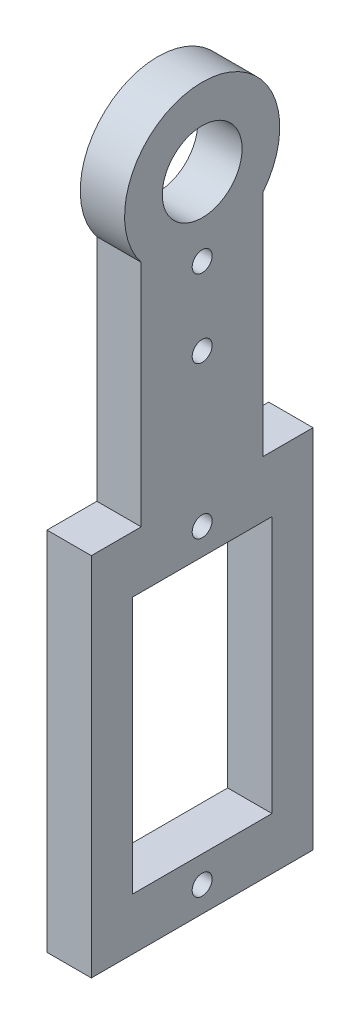
ISO-10303-21;
HEADER;
FILE_DESCRIPTION(('STEP AP214'),'2;1');
FILE_NAME('part.step','',(''),(''),'','','');
FILE_SCHEMA(('AUTOMOTIVE_DESIGN { 1 0 10303 214 1 1 1 1 }'));
ENDSEC;
DATA;
#1=APPLICATION_CONTEXT('core data for automotive mechanical design processes');
#2=APPLICATION_PROTOCOL_DEFINITION('international standard','automotive_design',2000,#1);
#3=PRODUCT_CONTEXT('',#1,'mechanical');
#4=PRODUCT('Part','Part','',(#3));
#5=PRODUCT_RELATED_PRODUCT_CATEGORY('part','',(#4));
#6=PRODUCT_DEFINITION_FORMATION('','',#4);
#7=PRODUCT_DEFINITION_CONTEXT('part definition',#1,'design');
#8=PRODUCT_DEFINITION('design','',#6,#7);
#9=PRODUCT_DEFINITION_SHAPE('','',#8);
#10=(LENGTH_UNIT() NAMED_UNIT(*) SI_UNIT(.MILLI.,.METRE.));
#11=(NAMED_UNIT(*) PLANE_ANGLE_UNIT() SI_UNIT($,.RADIAN.));
#12=(NAMED_UNIT(*) SI_UNIT($,.STERADIAN.) SOLID_ANGLE_UNIT());
#13=UNCERTAINTY_MEASURE_WITH_UNIT(LENGTH_MEASURE(1.E-05),#10,'distance_accuracy_value','');
#14=(GEOMETRIC_REPRESENTATION_CONTEXT(3) GLOBAL_UNCERTAINTY_ASSIGNED_CONTEXT((#13)) GLOBAL_UNIT_ASSIGNED_CONTEXT((#10,
#11,#12)) REPRESENTATION_CONTEXT('',''));
#15=CARTESIAN_POINT('',(0.,0.,0.));
#16=DIRECTION('',(0.,0.,1.));
#17=DIRECTION('',(1.,0.,0.));
#18=AXIS2_PLACEMENT_3D('',#15,#16,#17);
#19=CARTESIAN_POINT('',(4.,0.,0.));
#20=DIRECTION('',(1.,0.,0.));
#21=DIRECTION('',(0.,0.,-1.));
#22=AXIS2_PLACEMENT_3D('',#19,#20,#21);
#23=PLANE('',#22);
#24=CARTESIAN_POINT('',(4.,-55.7,0.));
#25=DIRECTION('',(1.,0.,0.));
#26=DIRECTION('',(0.,0.,-1.));
#27=AXIS2_PLACEMENT_3D('',#24,#25,#26);
#28=CIRCLE('',#27,0.9);
#29=CARTESIAN_POINT('',(4.,-55.7,-0.9));
#30=VERTEX_POINT('',#29);
#31=EDGE_CURVE('E237',#30,#30,#28,.F.);
#32=ORIENTED_EDGE('',*,*,#31,.T.);
#33=EDGE_LOOP('',(#32));
#34=FACE_BOUND('',#33,.T.);
#35=CARTESIAN_POINT('',(4.,-27.7,0.));
#36=DIRECTION('',(1.,0.,0.));
#37=DIRECTION('',(0.,0.,-1.));
#38=AXIS2_PLACEMENT_3D('',#35,#36,#37);
#39=CIRCLE('',#38,0.9);
#40=CARTESIAN_POINT('',(4.,-27.7,-0.9));
#41=VERTEX_POINT('',#40);
#42=EDGE_CURVE('E236',#41,#41,#39,.F.);
#43=ORIENTED_EDGE('',*,*,#42,.T.);
#44=EDGE_LOOP('',(#43));
#45=FACE_BOUND('',#44,.T.);
#46=CARTESIAN_POINT('',(4.,-14.,0.));
#47=DIRECTION('',(1.,0.,0.));
#48=DIRECTION('',(0.,0.,-1.));
#49=AXIS2_PLACEMENT_3D('',#46,#47,#48);
#50=CIRCLE('',#49,0.9);
#51=CARTESIAN_POINT('',(4.,-14.,-0.9));
#52=VERTEX_POINT('',#51);
#53=EDGE_CURVE('E155',#52,#52,#50,.F.);
#54=ORIENTED_EDGE('',*,*,#53,.T.);
#55=EDGE_LOOP('',(#54));
#56=FACE_BOUND('',#55,.T.);
#57=CARTESIAN_POINT('',(4.,-7.,0.));
#58=DIRECTION('',(1.,0.,0.));
#59=DIRECTION('',(0.,0.,-1.));
#60=AXIS2_PLACEMENT_3D('',#57,#58,#59);
#61=CIRCLE('',#60,0.9);
#62=CARTESIAN_POINT('',(4.,-7.,-0.9));
#63=VERTEX_POINT('',#62);
#64=EDGE_CURVE('E159',#63,#63,#61,.F.);
#65=ORIENTED_EDGE('',*,*,#64,.T.);
#66=EDGE_LOOP('',(#65));
#67=FACE_BOUND('',#66,.T.);
#68=CARTESIAN_POINT('',(4.,0.,0.));
#69=DIRECTION('',(1.,0.,0.));
#70=DIRECTION('',(0.,0.,-1.));
#71=AXIS2_PLACEMENT_3D('',#68,#69,#70);
#72=CIRCLE('',#71,3.6);
#73=CARTESIAN_POINT('',(4.,0.,-3.6));
#74=VERTEX_POINT('',#73);
#75=EDGE_CURVE('E163',#74,#74,#72,.F.);
#76=ORIENTED_EDGE('',*,*,#75,.T.);
#77=EDGE_LOOP('',(#76));
#78=FACE_BOUND('',#77,.T.);
#79=DIRECTION('',(0.,0.,-1.));
#80=VECTOR('',#79,1.);
#81=CARTESIAN_POINT('',(4.,-25.,10.));
#82=LINE('',#81,#80);
#83=CARTESIAN_POINT('',(4.,-25.,-5.5));
#84=VERTEX_POINT('',#83);
#85=CARTESIAN_POINT('',(4.,-25.,-10.));
#86=VERTEX_POINT('',#85);
#87=EDGE_CURVE('E190',#84,#86,#82,.T.);
#88=ORIENTED_EDGE('',*,*,#87,.F.);
#89=DIRECTION('',(0.,1.,0.));
#90=VECTOR('',#89,1.);
#91=CARTESIAN_POINT('',(4.,-36.,-5.5));
#92=LINE('',#91,#90);
#93=CARTESIAN_POINT('',(4.,-4.33012701892219,-5.5));
#94=VERTEX_POINT('',#93);
#95=EDGE_CURVE('E206',#84,#94,#92,.T.);
#96=ORIENTED_EDGE('',*,*,#95,.T.);
#97=CARTESIAN_POINT('',(4.,0.,0.));
#98=DIRECTION('',(1.,0.,0.));
#99=DIRECTION('',(0.,0.,-1.));
#100=AXIS2_PLACEMENT_3D('',#97,#98,#99);
#101=CIRCLE('',#100,7.);
#102=CARTESIAN_POINT('',(4.,-4.33012701892219,5.5));
#103=VERTEX_POINT('',#102);
#104=EDGE_CURVE('E217',#94,#103,#101,.T.);
#105=ORIENTED_EDGE('',*,*,#104,.T.);
#106=DIRECTION('',(0.,1.,0.));
#107=VECTOR('',#106,1.);
#108=CARTESIAN_POINT('',(4.,-36.,5.5));
#109=LINE('',#108,#107);
#110=CARTESIAN_POINT('',(4.,-25.,5.5));
#111=VERTEX_POINT('',#110);
#112=EDGE_CURVE('E205',#111,#103,#109,.T.);
#113=ORIENTED_EDGE('',*,*,#112,.F.);
#114=CARTESIAN_POINT('',(4.,-25.,10.));
#115=VERTEX_POINT('',#114);
#116=EDGE_CURVE('E191',#115,#111,#82,.T.);
#117=ORIENTED_EDGE('',*,*,#116,.F.);
#118=DIRECTION('',(0.,1.,0.));
#119=VECTOR('',#118,1.);
#120=CARTESIAN_POINT('',(4.,-58.,10.));
#121=LINE('',#120,#119);
#122=CARTESIAN_POINT('',(4.,-58.,10.));
#123=VERTEX_POINT('',#122);
#124=EDGE_CURVE('E173',#123,#115,#121,.T.);
#125=ORIENTED_EDGE('',*,*,#124,.F.);
#126=DIRECTION('',(0.,0.,-1.));
#127=VECTOR('',#126,1.);
#128=CARTESIAN_POINT('',(4.,-58.,10.));
#129=LINE('',#128,#127);
#130=CARTESIAN_POINT('',(4.,-58.,-10.));
#131=VERTEX_POINT('',#130);
#132=EDGE_CURVE('E193',#123,#131,#129,.T.);
#133=ORIENTED_EDGE('',*,*,#132,.T.);
#134=DIRECTION('',(0.,1.,0.));
#135=VECTOR('',#134,1.);
#136=CARTESIAN_POINT('',(4.,-58.,-10.));
#137=LINE('',#136,#135);
#138=EDGE_CURVE('E182',#131,#86,#137,.T.);
#139=ORIENTED_EDGE('',*,*,#138,.T.);
#140=EDGE_LOOP('',(#88,#96,#105,#113,#117,#125,#133,#139));
#141=FACE_BOUND('',#140,.T.);
#142=DIRECTION('',(0.,0.,1.));
#143=VECTOR('',#142,1.);
#144=CARTESIAN_POINT('',(4.,-53.3,0.));
#145=LINE('',#144,#143);
#146=CARTESIAN_POINT('',(4.,-53.3,-6.3));
#147=VERTEX_POINT('',#146);
#148=CARTESIAN_POINT('',(4.,-53.3,6.3));
#149=VERTEX_POINT('',#148);
#150=EDGE_CURVE('E149',#147,#149,#145,.T.);
#151=ORIENTED_EDGE('',*,*,#150,.T.);
#152=DIRECTION('',(0.,1.,0.));
#153=VECTOR('',#152,1.);
#154=CARTESIAN_POINT('',(4.,0.,6.3));
#155=LINE('',#154,#153);
#156=CARTESIAN_POINT('',(4.,-30.1,6.3));
#157=VERTEX_POINT('',#156);
#158=EDGE_CURVE('E135',#149,#157,#155,.T.);
#159=ORIENTED_EDGE('',*,*,#158,.T.);
#160=DIRECTION('',(0.,0.,-1.));
#161=VECTOR('',#160,1.);
#162=CARTESIAN_POINT('',(4.,-30.1,0.));
#163=LINE('',#162,#161);
#164=CARTESIAN_POINT('',(4.,-30.1,-6.3));
#165=VERTEX_POINT('',#164);
#166=EDGE_CURVE('E141',#157,#165,#163,.T.);
#167=ORIENTED_EDGE('',*,*,#166,.T.);
#168=DIRECTION('',(0.,1.,0.));
#169=VECTOR('',#168,1.);
#170=CARTESIAN_POINT('',(4.,0.,-6.3));
#171=LINE('',#170,#169);
#172=EDGE_CURVE('E130',#147,#165,#171,.T.);
#173=ORIENTED_EDGE('',*,*,#172,.F.);
#174=EDGE_LOOP('',(#151,#159,#167,#173));
#175=FACE_BOUND('',#174,.T.);
#176=ADVANCED_FACE('F43',(#34,#45,#56,#67,#78,#141,#175),#23,.T.);
#177=CARTESIAN_POINT('',(0.,0.,0.));
#178=DIRECTION('',(1.,0.,0.));
#179=DIRECTION('',(0.,0.,-1.));
#180=AXIS2_PLACEMENT_3D('',#177,#178,#179);
#181=PLANE('',#180);
#182=CARTESIAN_POINT('',(0.,-55.7,0.));
#183=DIRECTION('',(1.,0.,0.));
#184=DIRECTION('',(0.,0.,-1.));
#185=AXIS2_PLACEMENT_3D('',#182,#183,#184);
#186=CIRCLE('',#185,0.9);
#187=CARTESIAN_POINT('',(0.,-55.7,-0.9));
#188=VERTEX_POINT('',#187);
#189=EDGE_CURVE('E47',#188,#188,#186,.F.);
#190=ORIENTED_EDGE('',*,*,#189,.F.);
#191=EDGE_LOOP('',(#190));
#192=FACE_BOUND('',#191,.T.);
#193=CARTESIAN_POINT('',(0.,-27.7,0.));
#194=DIRECTION('',(1.,0.,0.));
#195=DIRECTION('',(0.,0.,-1.));
#196=AXIS2_PLACEMENT_3D('',#193,#194,#195);
#197=CIRCLE('',#196,0.9);
#198=CARTESIAN_POINT('',(0.,-27.7,-0.9));
#199=VERTEX_POINT('',#198);
#200=EDGE_CURVE('E234',#199,#199,#197,.F.);
#201=ORIENTED_EDGE('',*,*,#200,.F.);
#202=EDGE_LOOP('',(#201));
#203=FACE_BOUND('',#202,.T.);
#204=DIRECTION('',(0.,0.,-1.));
#205=VECTOR('',#204,1.);
#206=CARTESIAN_POINT('',(0.,-25.,10.));
#207=LINE('',#206,#205);
#208=CARTESIAN_POINT('',(0.,-25.,10.));
#209=VERTEX_POINT('',#208);
#210=CARTESIAN_POINT('',(0.,-25.,5.5));
#211=VERTEX_POINT('',#210);
#212=EDGE_CURVE('E187',#209,#211,#207,.T.);
#213=ORIENTED_EDGE('',*,*,#212,.T.);
#214=DIRECTION('',(0.,-1.,0.));
#215=VECTOR('',#214,1.);
#216=CARTESIAN_POINT('',(0.,-36.,5.5));
#217=LINE('',#216,#215);
#218=CARTESIAN_POINT('',(0.,-4.33012701892219,5.5));
#219=VERTEX_POINT('',#218);
#220=EDGE_CURVE('E202',#219,#211,#217,.T.);
#221=ORIENTED_EDGE('',*,*,#220,.F.);
#222=CARTESIAN_POINT('',(0.,0.,0.));
#223=DIRECTION('',(1.,0.,0.));
#224=DIRECTION('',(0.,0.,-1.));
#225=AXIS2_PLACEMENT_3D('',#222,#223,#224);
#226=CIRCLE('',#225,7.);
#227=CARTESIAN_POINT('',(0.,-4.33012701892219,-5.5));
#228=VERTEX_POINT('',#227);
#229=EDGE_CURVE('E216',#228,#219,#226,.T.);
#230=ORIENTED_EDGE('',*,*,#229,.F.);
#231=DIRECTION('',(0.,-1.,0.));
#232=VECTOR('',#231,1.);
#233=CARTESIAN_POINT('',(0.,-36.,-5.5));
#234=LINE('',#233,#232);
#235=CARTESIAN_POINT('',(0.,-25.,-5.5));
#236=VERTEX_POINT('',#235);
#237=EDGE_CURVE('E201',#228,#236,#234,.T.);
#238=ORIENTED_EDGE('',*,*,#237,.T.);
#239=CARTESIAN_POINT('',(0.,-25.,-10.));
#240=VERTEX_POINT('',#239);
#241=EDGE_CURVE('E177',#236,#240,#207,.T.);
#242=ORIENTED_EDGE('',*,*,#241,.T.);
#243=DIRECTION('',(0.,-1.,0.));
#244=VECTOR('',#243,1.);
#245=CARTESIAN_POINT('',(0.,-58.,-10.));
#246=LINE('',#245,#244);
#247=CARTESIAN_POINT('',(0.,-58.,-10.));
#248=VERTEX_POINT('',#247);
#249=EDGE_CURVE('E166',#240,#248,#246,.T.);
#250=ORIENTED_EDGE('',*,*,#249,.T.);
#251=DIRECTION('',(0.,0.,-1.));
#252=VECTOR('',#251,1.);
#253=CARTESIAN_POINT('',(0.,-58.,10.));
#254=LINE('',#253,#252);
#255=CARTESIAN_POINT('',(0.,-58.,10.));
#256=VERTEX_POINT('',#255);
#257=EDGE_CURVE('E196',#256,#248,#254,.T.);
#258=ORIENTED_EDGE('',*,*,#257,.F.);
#259=DIRECTION('',(0.,-1.,0.));
#260=VECTOR('',#259,1.);
#261=CARTESIAN_POINT('',(0.,-58.,10.));
#262=LINE('',#261,#260);
#263=EDGE_CURVE('E167',#209,#256,#262,.T.);
#264=ORIENTED_EDGE('',*,*,#263,.F.);
#265=EDGE_LOOP('',(#213,#221,#230,#238,#242,#250,#258,#264));
#266=FACE_BOUND('',#265,.T.);
#267=CARTESIAN_POINT('',(0.,0.,0.));
#268=DIRECTION('',(1.,0.,0.));
#269=DIRECTION('',(0.,0.,-1.));
#270=AXIS2_PLACEMENT_3D('',#267,#268,#269);
#271=CIRCLE('',#270,3.6);
#272=CARTESIAN_POINT('',(0.,0.,-3.6));
#273=VERTEX_POINT('',#272);
#274=EDGE_CURVE('E162',#273,#273,#271,.F.);
#275=ORIENTED_EDGE('',*,*,#274,.F.);
#276=EDGE_LOOP('',(#275));
#277=FACE_BOUND('',#276,.T.);
#278=CARTESIAN_POINT('',(0.,-7.,0.));
#279=DIRECTION('',(1.,0.,0.));
#280=DIRECTION('',(0.,0.,-1.));
#281=AXIS2_PLACEMENT_3D('',#278,#279,#280);
#282=CIRCLE('',#281,0.9);
#283=CARTESIAN_POINT('',(0.,-7.,-0.9));
#284=VERTEX_POINT('',#283);
#285=EDGE_CURVE('E158',#284,#284,#282,.F.);
#286=ORIENTED_EDGE('',*,*,#285,.F.);
#287=EDGE_LOOP('',(#286));
#288=FACE_BOUND('',#287,.T.);
#289=CARTESIAN_POINT('',(0.,-14.,0.));
#290=DIRECTION('',(1.,0.,0.));
#291=DIRECTION('',(0.,0.,-1.));
#292=AXIS2_PLACEMENT_3D('',#289,#290,#291);
#293=CIRCLE('',#292,0.9);
#294=CARTESIAN_POINT('',(0.,-14.,-0.9));
#295=VERTEX_POINT('',#294);
#296=EDGE_CURVE('E151',#295,#295,#293,.F.);
#297=ORIENTED_EDGE('',*,*,#296,.F.);
#298=EDGE_LOOP('',(#297));
#299=FACE_BOUND('',#298,.T.);
#300=DIRECTION('',(0.,1.,0.));
#301=VECTOR('',#300,1.);
#302=CARTESIAN_POINT('',(0.,0.,6.3));
#303=LINE('',#302,#301);
#304=CARTESIAN_POINT('',(0.,-53.3,6.3));
#305=VERTEX_POINT('',#304);
#306=CARTESIAN_POINT('',(0.,-30.1,6.3));
#307=VERTEX_POINT('',#306);
#308=EDGE_CURVE('E11',#305,#307,#303,.T.);
#309=ORIENTED_EDGE('',*,*,#308,.F.);
#310=DIRECTION('',(0.,0.,1.));
#311=VECTOR('',#310,1.);
#312=CARTESIAN_POINT('',(0.,-53.3,0.));
#313=LINE('',#312,#311);
#314=CARTESIAN_POINT('',(0.,-53.3,-6.3));
#315=VERTEX_POINT('',#314);
#316=EDGE_CURVE('E52',#315,#305,#313,.T.);
#317=ORIENTED_EDGE('',*,*,#316,.F.);
#318=DIRECTION('',(0.,1.,0.));
#319=VECTOR('',#318,1.);
#320=CARTESIAN_POINT('',(0.,0.,-6.3));
#321=LINE('',#320,#319);
#322=CARTESIAN_POINT('',(0.,-30.1,-6.3));
#323=VERTEX_POINT('',#322);
#324=EDGE_CURVE('E225',#315,#323,#321,.T.);
#325=ORIENTED_EDGE('',*,*,#324,.T.);
#326=DIRECTION('',(0.,0.,-1.));
#327=VECTOR('',#326,1.);
#328=CARTESIAN_POINT('',(0.,-30.1,0.));
#329=LINE('',#328,#327);
#330=EDGE_CURVE('E144',#307,#323,#329,.T.);
#331=ORIENTED_EDGE('',*,*,#330,.F.);
#332=EDGE_LOOP('',(#309,#317,#325,#331));
#333=FACE_BOUND('',#332,.T.);
#334=ADVANCED_FACE('F254',(#192,#203,#266,#277,#288,#299,#333),#181,.F.);
#335=CARTESIAN_POINT('',(0.,0.,5.5));
#336=DIRECTION('',(0.,0.,-1.));
#337=DIRECTION('',(-1.,0.,0.));
#338=AXIS2_PLACEMENT_3D('',#335,#336,#337);
#339=PLANE('',#338);
#340=DIRECTION('',(-1.,0.,0.));
#341=VECTOR('',#340,1.);
#342=CARTESIAN_POINT('',(0.,-25.,5.5));
#343=LINE('',#342,#341);
#344=EDGE_CURVE('E199',#111,#211,#343,.T.);
#345=ORIENTED_EDGE('',*,*,#344,.F.);
#346=ORIENTED_EDGE('',*,*,#112,.T.);
#347=DIRECTION('',(-1.,0.,0.));
#348=VECTOR('',#347,1.);
#349=CARTESIAN_POINT('',(4.,-4.33012701892219,5.5));
#350=LINE('',#349,#348);
#351=EDGE_CURVE('E214',#103,#219,#350,.T.);
#352=ORIENTED_EDGE('',*,*,#351,.T.);
#353=ORIENTED_EDGE('',*,*,#220,.T.);
#354=EDGE_LOOP('',(#345,#346,#352,#353));
#355=FACE_BOUND('',#354,.T.);
#356=ADVANCED_FACE('F276',(#355),#339,.F.);
#357=CARTESIAN_POINT('',(0.,0.,-5.5));
#358=DIRECTION('',(0.,0.,-1.));
#359=DIRECTION('',(-1.,0.,0.));
#360=AXIS2_PLACEMENT_3D('',#357,#358,#359);
#361=PLANE('',#360);
#362=ORIENTED_EDGE('',*,*,#95,.F.);
#363=DIRECTION('',(-1.,0.,0.));
#364=VECTOR('',#363,1.);
#365=CARTESIAN_POINT('',(0.,-25.,-5.5));
#366=LINE('',#365,#364);
#367=EDGE_CURVE('E220',#84,#236,#366,.T.);
#368=ORIENTED_EDGE('',*,*,#367,.T.);
#369=ORIENTED_EDGE('',*,*,#237,.F.);
#370=DIRECTION('',(-1.,0.,0.));
#371=VECTOR('',#370,1.);
#372=CARTESIAN_POINT('',(4.,-4.33012701892219,-5.5));
#373=LINE('',#372,#371);
#374=EDGE_CURVE('E208',#94,#228,#373,.T.);
#375=ORIENTED_EDGE('',*,*,#374,.F.);
#376=EDGE_LOOP('',(#362,#368,#369,#375));
#377=FACE_BOUND('',#376,.T.);
#378=ADVANCED_FACE('F280',(#377),#361,.T.);
#379=CARTESIAN_POINT('',(4.,0.,0.));
#380=DIRECTION('',(-1.,0.,0.));
#381=DIRECTION('',(0.,0.,1.));
#382=AXIS2_PLACEMENT_3D('',#379,#380,#381);
#383=CYLINDRICAL_SURFACE('',#382,7.);
#384=ORIENTED_EDGE('',*,*,#351,.F.);
#385=ORIENTED_EDGE('',*,*,#104,.F.);
#386=ORIENTED_EDGE('',*,*,#374,.T.);
#387=ORIENTED_EDGE('',*,*,#229,.T.);
#388=EDGE_LOOP('',(#384,#385,#386,#387));
#389=FACE_BOUND('',#388,.T.);
#390=ADVANCED_FACE('F45',(#389),#383,.T.);
#391=CARTESIAN_POINT('',(0.,-25.,10.));
#392=DIRECTION('',(0.,-1.,0.));
#393=DIRECTION('',(0.,0.,-1.));
#394=AXIS2_PLACEMENT_3D('',#391,#392,#393);
#395=PLANE('',#394);
#396=ORIENTED_EDGE('',*,*,#116,.T.);
#397=ORIENTED_EDGE('',*,*,#344,.T.);
#398=ORIENTED_EDGE('',*,*,#212,.F.);
#399=DIRECTION('',(-1.,0.,0.));
#400=VECTOR('',#399,1.);
#401=CARTESIAN_POINT('',(0.,-25.,10.));
#402=LINE('',#401,#400);
#403=EDGE_CURVE('E175',#115,#209,#402,.T.);
#404=ORIENTED_EDGE('',*,*,#403,.F.);
#405=EDGE_LOOP('',(#396,#397,#398,#404));
#406=FACE_BOUND('',#405,.T.);
#407=ADVANCED_FACE('F291',(#406),#395,.F.);
#408=CARTESIAN_POINT('',(0.,-58.,10.));
#409=DIRECTION('',(0.,1.,0.));
#410=DIRECTION('',(0.,0.,1.));
#411=AXIS2_PLACEMENT_3D('',#408,#409,#410);
#412=PLANE('',#411);
#413=DIRECTION('',(1.,0.,0.));
#414=VECTOR('',#413,1.);
#415=CARTESIAN_POINT('',(0.,-58.,-10.));
#416=LINE('',#415,#414);
#417=EDGE_CURVE('E180',#248,#131,#416,.T.);
#418=ORIENTED_EDGE('',*,*,#417,.T.);
#419=ORIENTED_EDGE('',*,*,#132,.F.);
#420=DIRECTION('',(1.,0.,0.));
#421=VECTOR('',#420,1.);
#422=CARTESIAN_POINT('',(0.,-58.,10.));
#423=LINE('',#422,#421);
#424=EDGE_CURVE('E170',#256,#123,#423,.T.);
#425=ORIENTED_EDGE('',*,*,#424,.F.);
#426=ORIENTED_EDGE('',*,*,#257,.T.);
#427=EDGE_LOOP('',(#418,#419,#425,#426));
#428=FACE_BOUND('',#427,.T.);
#429=ADVANCED_FACE('F287',(#428),#412,.F.);
#430=ORIENTED_EDGE('',*,*,#367,.F.);
#431=ORIENTED_EDGE('',*,*,#87,.T.);
#432=DIRECTION('',(-1.,0.,0.));
#433=VECTOR('',#432,1.);
#434=CARTESIAN_POINT('',(0.,-25.,-10.));
#435=LINE('',#434,#433);
#436=EDGE_CURVE('E171',#86,#240,#435,.T.);
#437=ORIENTED_EDGE('',*,*,#436,.T.);
#438=ORIENTED_EDGE('',*,*,#241,.F.);
#439=EDGE_LOOP('',(#430,#431,#437,#438));
#440=FACE_BOUND('',#439,.T.);
#441=ADVANCED_FACE('F290',(#440),#395,.F.);
#442=CARTESIAN_POINT('',(0.,0.,10.));
#443=DIRECTION('',(0.,0.,-1.));
#444=DIRECTION('',(-1.,0.,0.));
#445=AXIS2_PLACEMENT_3D('',#442,#443,#444);
#446=PLANE('',#445);
#447=ORIENTED_EDGE('',*,*,#263,.T.);
#448=ORIENTED_EDGE('',*,*,#424,.T.);
#449=ORIENTED_EDGE('',*,*,#124,.T.);
#450=ORIENTED_EDGE('',*,*,#403,.T.);
#451=EDGE_LOOP('',(#447,#448,#449,#450));
#452=FACE_BOUND('',#451,.T.);
#453=ADVANCED_FACE('F295',(#452),#446,.F.);
#454=CARTESIAN_POINT('',(0.,0.,-10.));
#455=DIRECTION('',(0.,0.,-1.));
#456=DIRECTION('',(-1.,0.,0.));
#457=AXIS2_PLACEMENT_3D('',#454,#455,#456);
#458=PLANE('',#457);
#459=ORIENTED_EDGE('',*,*,#249,.F.);
#460=ORIENTED_EDGE('',*,*,#436,.F.);
#461=ORIENTED_EDGE('',*,*,#138,.F.);
#462=ORIENTED_EDGE('',*,*,#417,.F.);
#463=EDGE_LOOP('',(#459,#460,#461,#462));
#464=FACE_BOUND('',#463,.T.);
#465=ADVANCED_FACE('F297',(#464),#458,.T.);
#466=CARTESIAN_POINT('',(5.,0.,0.));
#467=DIRECTION('',(-1.,0.,0.));
#468=DIRECTION('',(0.,0.,1.));
#469=AXIS2_PLACEMENT_3D('',#466,#467,#468);
#470=CYLINDRICAL_SURFACE('',#469,3.6);
#471=ORIENTED_EDGE('',*,*,#75,.F.);
#472=EDGE_LOOP('',(#471));
#473=FACE_BOUND('',#472,.T.);
#474=ORIENTED_EDGE('',*,*,#274,.T.);
#475=EDGE_LOOP('',(#474));
#476=FACE_BOUND('',#475,.T.);
#477=ADVANCED_FACE('F300',(#473,#476),#470,.F.);
#478=CARTESIAN_POINT('',(5.,-7.,0.));
#479=DIRECTION('',(-1.,0.,0.));
#480=DIRECTION('',(0.,0.,1.));
#481=AXIS2_PLACEMENT_3D('',#478,#479,#480);
#482=CYLINDRICAL_SURFACE('',#481,0.9);
#483=ORIENTED_EDGE('',*,*,#64,.F.);
#484=EDGE_LOOP('',(#483));
#485=FACE_BOUND('',#484,.T.);
#486=ORIENTED_EDGE('',*,*,#285,.T.);
#487=EDGE_LOOP('',(#486));
#488=FACE_BOUND('',#487,.T.);
#489=ADVANCED_FACE('F307',(#485,#488),#482,.F.);
#490=CARTESIAN_POINT('',(5.,-14.,0.));
#491=DIRECTION('',(-1.,0.,0.));
#492=DIRECTION('',(0.,0.,1.));
#493=AXIS2_PLACEMENT_3D('',#490,#491,#492);
#494=CYLINDRICAL_SURFACE('',#493,0.9);
#495=ORIENTED_EDGE('',*,*,#53,.F.);
#496=EDGE_LOOP('',(#495));
#497=FACE_BOUND('',#496,.T.);
#498=ORIENTED_EDGE('',*,*,#296,.T.);
#499=EDGE_LOOP('',(#498));
#500=FACE_BOUND('',#499,.T.);
#501=ADVANCED_FACE('F311',(#497,#500),#494,.F.);
#502=CARTESIAN_POINT('',(-1.,-53.3,6.3));
#503=DIRECTION('',(0.,1.,0.));
#504=DIRECTION('',(0.,0.,1.));
#505=AXIS2_PLACEMENT_3D('',#502,#503,#504);
#506=PLANE('',#505);
#507=DIRECTION('',(1.,0.,0.));
#508=VECTOR('',#507,1.);
#509=CARTESIAN_POINT('',(-1.,-53.3,-6.3));
#510=LINE('',#509,#508);
#511=EDGE_CURVE('E60',#315,#147,#510,.T.);
#512=ORIENTED_EDGE('',*,*,#511,.F.);
#513=ORIENTED_EDGE('',*,*,#316,.T.);
#514=DIRECTION('',(1.,0.,0.));
#515=VECTOR('',#514,1.);
#516=CARTESIAN_POINT('',(-1.,-53.3,6.3));
#517=LINE('',#516,#515);
#518=EDGE_CURVE('E146',#305,#149,#517,.T.);
#519=ORIENTED_EDGE('',*,*,#518,.T.);
#520=ORIENTED_EDGE('',*,*,#150,.F.);
#521=EDGE_LOOP('',(#512,#513,#519,#520));
#522=FACE_BOUND('',#521,.T.);
#523=ADVANCED_FACE('F257',(#522),#506,.T.);
#524=CARTESIAN_POINT('',(-1.,-30.1,6.3));
#525=DIRECTION('',(0.,-1.,0.));
#526=DIRECTION('',(0.,0.,-1.));
#527=AXIS2_PLACEMENT_3D('',#524,#525,#526);
#528=PLANE('',#527);
#529=DIRECTION('',(-1.,0.,0.));
#530=VECTOR('',#529,1.);
#531=CARTESIAN_POINT('',(-1.,-30.1,6.3));
#532=LINE('',#531,#530);
#533=EDGE_CURVE('E136',#157,#307,#532,.T.);
#534=ORIENTED_EDGE('',*,*,#533,.T.);
#535=ORIENTED_EDGE('',*,*,#330,.T.);
#536=DIRECTION('',(-1.,0.,0.));
#537=VECTOR('',#536,1.);
#538=CARTESIAN_POINT('',(-1.,-30.1,-6.3));
#539=LINE('',#538,#537);
#540=EDGE_CURVE('E65',#165,#323,#539,.T.);
#541=ORIENTED_EDGE('',*,*,#540,.F.);
#542=ORIENTED_EDGE('',*,*,#166,.F.);
#543=EDGE_LOOP('',(#534,#535,#541,#542));
#544=FACE_BOUND('',#543,.T.);
#545=ADVANCED_FACE('F140',(#544),#528,.T.);
#546=CARTESIAN_POINT('',(0.,0.,6.3));
#547=DIRECTION('',(0.,0.,-1.));
#548=DIRECTION('',(-1.,0.,0.));
#549=AXIS2_PLACEMENT_3D('',#546,#547,#548);
#550=PLANE('',#549);
#551=ORIENTED_EDGE('',*,*,#518,.F.);
#552=ORIENTED_EDGE('',*,*,#308,.T.);
#553=ORIENTED_EDGE('',*,*,#533,.F.);
#554=ORIENTED_EDGE('',*,*,#158,.F.);
#555=EDGE_LOOP('',(#551,#552,#553,#554));
#556=FACE_BOUND('',#555,.T.);
#557=ADVANCED_FACE('F259',(#556),#550,.T.);
#558=CARTESIAN_POINT('',(0.,0.,-6.3));
#559=DIRECTION('',(0.,0.,-1.));
#560=DIRECTION('',(-1.,0.,0.));
#561=AXIS2_PLACEMENT_3D('',#558,#559,#560);
#562=PLANE('',#561);
#563=ORIENTED_EDGE('',*,*,#172,.T.);
#564=ORIENTED_EDGE('',*,*,#540,.T.);
#565=ORIENTED_EDGE('',*,*,#324,.F.);
#566=ORIENTED_EDGE('',*,*,#511,.T.);
#567=EDGE_LOOP('',(#563,#564,#565,#566));
#568=FACE_BOUND('',#567,.T.);
#569=ADVANCED_FACE('F131',(#568),#562,.F.);
#570=CARTESIAN_POINT('',(5.,-27.7,0.));
#571=DIRECTION('',(-1.,0.,0.));
#572=DIRECTION('',(0.,0.,1.));
#573=AXIS2_PLACEMENT_3D('',#570,#571,#572);
#574=CYLINDRICAL_SURFACE('',#573,0.9);
#575=ORIENTED_EDGE('',*,*,#42,.F.);
#576=EDGE_LOOP('',(#575));
#577=FACE_BOUND('',#576,.T.);
#578=ORIENTED_EDGE('',*,*,#200,.T.);
#579=EDGE_LOOP('',(#578));
#580=FACE_BOUND('',#579,.T.);
#581=ADVANCED_FACE('F266',(#577,#580),#574,.F.);
#582=CARTESIAN_POINT('',(5.,-55.7,0.));
#583=DIRECTION('',(-1.,0.,0.));
#584=DIRECTION('',(0.,0.,1.));
#585=AXIS2_PLACEMENT_3D('',#582,#583,#584);
#586=CYLINDRICAL_SURFACE('',#585,0.9);
#587=ORIENTED_EDGE('',*,*,#31,.F.);
#588=EDGE_LOOP('',(#587));
#589=FACE_BOUND('',#588,.T.);
#590=ORIENTED_EDGE('',*,*,#189,.T.);
#591=EDGE_LOOP('',(#590));
#592=FACE_BOUND('',#591,.T.);
#593=ADVANCED_FACE('F348',(#589,#592),#586,.F.);
#594=CLOSED_SHELL('',(#176,#334,#356,#378,#390,#407,#429,#441,#453,#465,#477,#489,#501,#523,
#545,#557,#569,#581,#593));
#595=MANIFOLD_SOLID_BREP('B2',#594);
#596=ADVANCED_BREP_SHAPE_REPRESENTATION('',(#18,#595),#14);
#597=SHAPE_DEFINITION_REPRESENTATION(#9,#596);
ENDSEC;
END-ISO-10303-21;
